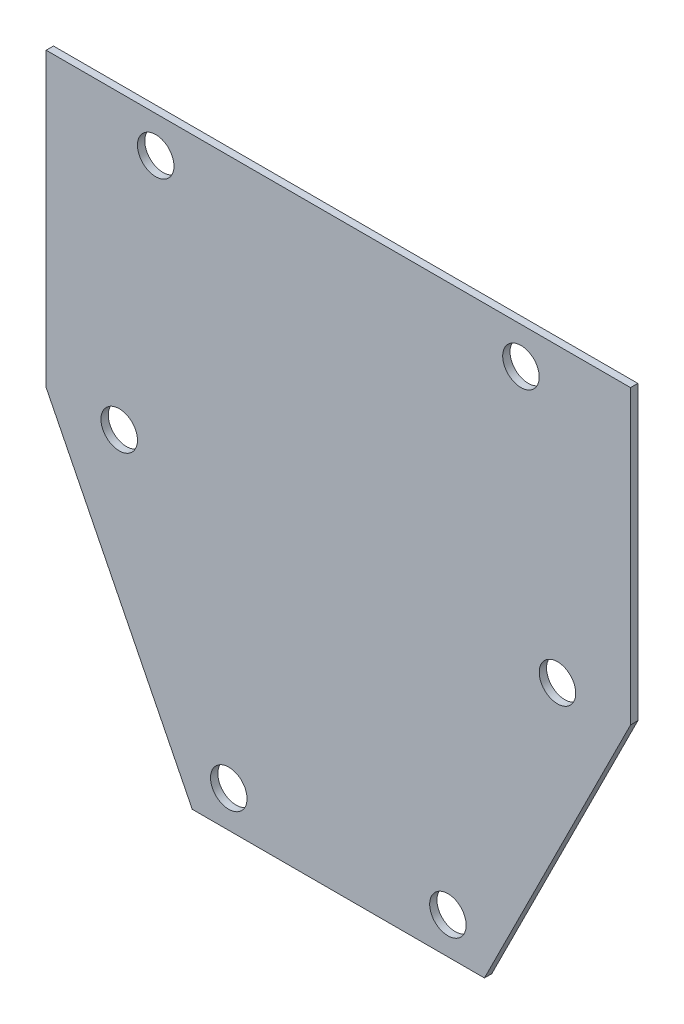
ISO-10303-21;
HEADER;
FILE_DESCRIPTION(('STEP AP214'),'2;1');
FILE_NAME('part.step','',(''),(''),'','','');
FILE_SCHEMA(('AUTOMOTIVE_DESIGN { 1 0 10303 214 1 1 1 1 }'));
ENDSEC;
DATA;
#1=APPLICATION_CONTEXT('core data for automotive mechanical design processes');
#2=APPLICATION_PROTOCOL_DEFINITION('international standard','automotive_design',2000,#1);
#3=PRODUCT_CONTEXT('',#1,'mechanical');
#4=PRODUCT('Part','Part','',(#3));
#5=PRODUCT_RELATED_PRODUCT_CATEGORY('part','',(#4));
#6=PRODUCT_DEFINITION_FORMATION('','',#4);
#7=PRODUCT_DEFINITION_CONTEXT('part definition',#1,'design');
#8=PRODUCT_DEFINITION('design','',#6,#7);
#9=PRODUCT_DEFINITION_SHAPE('','',#8);
#10=(LENGTH_UNIT() NAMED_UNIT(*) SI_UNIT(.MILLI.,.METRE.));
#11=(NAMED_UNIT(*) PLANE_ANGLE_UNIT() SI_UNIT($,.RADIAN.));
#12=(NAMED_UNIT(*) SI_UNIT($,.STERADIAN.) SOLID_ANGLE_UNIT());
#13=UNCERTAINTY_MEASURE_WITH_UNIT(LENGTH_MEASURE(1.E-05),#10,'distance_accuracy_value','');
#14=(GEOMETRIC_REPRESENTATION_CONTEXT(3) GLOBAL_UNCERTAINTY_ASSIGNED_CONTEXT((#13)) GLOBAL_UNIT_ASSIGNED_CONTEXT((#10,
#11,#12)) REPRESENTATION_CONTEXT('',''));
#15=CARTESIAN_POINT('',(0.,0.,0.));
#16=DIRECTION('',(0.,0.,1.));
#17=DIRECTION('',(1.,0.,0.));
#18=AXIS2_PLACEMENT_3D('',#15,#16,#17);
#19=CARTESIAN_POINT('',(32.,-16.,0.5));
#20=DIRECTION('',(0.894427190999916,-0.447213595499958,0.));
#21=DIRECTION('',(0.447213595499958,0.894427190999916,0.));
#22=AXIS2_PLACEMENT_3D('',#19,#20,#21);
#23=PLANE('',#22);
#24=DIRECTION('',(-0.447213595499958,-0.894427190999916,0.));
#25=VECTOR('',#24,1.);
#26=CARTESIAN_POINT('',(32.,-16.,-0.5));
#27=LINE('',#26,#25);
#28=CARTESIAN_POINT('',(40.,0.,-0.5));
#29=VERTEX_POINT('',#28);
#30=CARTESIAN_POINT('',(20.,-40.,-0.5));
#31=VERTEX_POINT('',#30);
#32=EDGE_CURVE('E146',#29,#31,#27,.T.);
#33=ORIENTED_EDGE('',*,*,#32,.F.);
#34=DIRECTION('',(0.,0.,-1.));
#35=VECTOR('',#34,1.);
#36=CARTESIAN_POINT('',(40.,0.,0.5));
#37=LINE('',#36,#35);
#38=CARTESIAN_POINT('',(40.,0.,0.5));
#39=VERTEX_POINT('',#38);
#40=EDGE_CURVE('E11',#39,#29,#37,.T.);
#41=ORIENTED_EDGE('',*,*,#40,.F.);
#42=DIRECTION('',(-0.447213595499958,-0.894427190999916,0.));
#43=VECTOR('',#42,1.);
#44=CARTESIAN_POINT('',(32.,-16.,0.5));
#45=LINE('',#44,#43);
#46=CARTESIAN_POINT('',(20.,-40.,0.5));
#47=VERTEX_POINT('',#46);
#48=EDGE_CURVE('E189',#39,#47,#45,.T.);
#49=ORIENTED_EDGE('',*,*,#48,.T.);
#50=DIRECTION('',(0.,0.,-1.));
#51=VECTOR('',#50,1.);
#52=CARTESIAN_POINT('',(20.,-40.,0.5));
#53=LINE('',#52,#51);
#54=EDGE_CURVE('E90',#47,#31,#53,.T.);
#55=ORIENTED_EDGE('',*,*,#54,.T.);
#56=EDGE_LOOP('',(#33,#41,#49,#55));
#57=FACE_BOUND('',#56,.T.);
#58=ADVANCED_FACE('F45',(#57),#23,.T.);
#59=CARTESIAN_POINT('',(40.,0.,0.5));
#60=DIRECTION('',(1.,0.,0.));
#61=DIRECTION('',(0.,0.,-1.));
#62=AXIS2_PLACEMENT_3D('',#59,#60,#61);
#63=PLANE('',#62);
#64=DIRECTION('',(0.,-1.,0.));
#65=VECTOR('',#64,1.);
#66=CARTESIAN_POINT('',(40.,0.,-0.5));
#67=LINE('',#66,#65);
#68=CARTESIAN_POINT('',(40.,40.,-0.5));
#69=VERTEX_POINT('',#68);
#70=EDGE_CURVE('E149',#69,#29,#67,.T.);
#71=ORIENTED_EDGE('',*,*,#70,.F.);
#72=DIRECTION('',(0.,0.,-1.));
#73=VECTOR('',#72,1.);
#74=CARTESIAN_POINT('',(40.,40.,0.5));
#75=LINE('',#74,#73);
#76=CARTESIAN_POINT('',(40.,40.,0.5));
#77=VERTEX_POINT('',#76);
#78=EDGE_CURVE('E54',#77,#69,#75,.T.);
#79=ORIENTED_EDGE('',*,*,#78,.F.);
#80=DIRECTION('',(0.,-1.,0.));
#81=VECTOR('',#80,1.);
#82=CARTESIAN_POINT('',(40.,0.,0.5));
#83=LINE('',#82,#81);
#84=EDGE_CURVE('E190',#77,#39,#83,.T.);
#85=ORIENTED_EDGE('',*,*,#84,.T.);
#86=ORIENTED_EDGE('',*,*,#40,.T.);
#87=EDGE_LOOP('',(#71,#79,#85,#86));
#88=FACE_BOUND('',#87,.T.);
#89=ADVANCED_FACE('F184',(#88),#63,.T.);
#90=CARTESIAN_POINT('',(0.,40.,0.5));
#91=DIRECTION('',(0.,1.,0.));
#92=DIRECTION('',(0.,0.,1.));
#93=AXIS2_PLACEMENT_3D('',#90,#91,#92);
#94=PLANE('',#93);
#95=DIRECTION('',(1.,0.,0.));
#96=VECTOR('',#95,1.);
#97=CARTESIAN_POINT('',(0.,40.,-0.5));
#98=LINE('',#97,#96);
#99=CARTESIAN_POINT('',(-40.,40.,-0.5));
#100=VERTEX_POINT('',#99);
#101=EDGE_CURVE('E152',#100,#69,#98,.T.);
#102=ORIENTED_EDGE('',*,*,#101,.F.);
#103=DIRECTION('',(0.,0.,-1.));
#104=VECTOR('',#103,1.);
#105=CARTESIAN_POINT('',(-40.,40.,0.5));
#106=LINE('',#105,#104);
#107=CARTESIAN_POINT('',(-40.,40.,0.5));
#108=VERTEX_POINT('',#107);
#109=EDGE_CURVE('E113',#108,#100,#106,.T.);
#110=ORIENTED_EDGE('',*,*,#109,.F.);
#111=DIRECTION('',(1.,0.,0.));
#112=VECTOR('',#111,1.);
#113=CARTESIAN_POINT('',(0.,40.,0.5));
#114=LINE('',#113,#112);
#115=EDGE_CURVE('E121',#108,#77,#114,.T.);
#116=ORIENTED_EDGE('',*,*,#115,.T.);
#117=ORIENTED_EDGE('',*,*,#78,.T.);
#118=EDGE_LOOP('',(#102,#110,#116,#117));
#119=FACE_BOUND('',#118,.T.);
#120=ADVANCED_FACE('F181',(#119),#94,.T.);
#121=CARTESIAN_POINT('',(-40.,0.,0.5));
#122=DIRECTION('',(-1.,0.,0.));
#123=DIRECTION('',(0.,0.,1.));
#124=AXIS2_PLACEMENT_3D('',#121,#122,#123);
#125=PLANE('',#124);
#126=DIRECTION('',(0.,1.,0.));
#127=VECTOR('',#126,1.);
#128=CARTESIAN_POINT('',(-40.,0.,-0.5));
#129=LINE('',#128,#127);
#130=CARTESIAN_POINT('',(-40.,0.,-0.5));
#131=VERTEX_POINT('',#130);
#132=EDGE_CURVE('E108',#131,#100,#129,.T.);
#133=ORIENTED_EDGE('',*,*,#132,.F.);
#134=DIRECTION('',(0.,0.,-1.));
#135=VECTOR('',#134,1.);
#136=CARTESIAN_POINT('',(-40.,0.,0.5));
#137=LINE('',#136,#135);
#138=CARTESIAN_POINT('',(-40.,0.,0.5));
#139=VERTEX_POINT('',#138);
#140=EDGE_CURVE('E103',#139,#131,#137,.T.);
#141=ORIENTED_EDGE('',*,*,#140,.F.);
#142=DIRECTION('',(0.,1.,0.));
#143=VECTOR('',#142,1.);
#144=CARTESIAN_POINT('',(-40.,0.,0.5));
#145=LINE('',#144,#143);
#146=EDGE_CURVE('E106',#139,#108,#145,.T.);
#147=ORIENTED_EDGE('',*,*,#146,.T.);
#148=ORIENTED_EDGE('',*,*,#109,.T.);
#149=EDGE_LOOP('',(#133,#141,#147,#148));
#150=FACE_BOUND('',#149,.T.);
#151=ADVANCED_FACE('F105',(#150),#125,.T.);
#152=CARTESIAN_POINT('',(-32.,-16.,0.5));
#153=DIRECTION('',(-0.894427190999916,-0.447213595499958,0.));
#154=DIRECTION('',(0.447213595499958,-0.894427190999916,0.));
#155=AXIS2_PLACEMENT_3D('',#152,#153,#154);
#156=PLANE('',#155);
#157=DIRECTION('',(-0.447213595499958,0.894427190999916,0.));
#158=VECTOR('',#157,1.);
#159=CARTESIAN_POINT('',(-32.,-16.,-0.5));
#160=LINE('',#159,#158);
#161=CARTESIAN_POINT('',(-20.,-40.,-0.5));
#162=VERTEX_POINT('',#161);
#163=EDGE_CURVE('E156',#162,#131,#160,.T.);
#164=ORIENTED_EDGE('',*,*,#163,.F.);
#165=DIRECTION('',(0.,0.,-1.));
#166=VECTOR('',#165,1.);
#167=CARTESIAN_POINT('',(-20.,-40.,0.5));
#168=LINE('',#167,#166);
#169=CARTESIAN_POINT('',(-20.,-40.,0.5));
#170=VERTEX_POINT('',#169);
#171=EDGE_CURVE('E83',#170,#162,#168,.T.);
#172=ORIENTED_EDGE('',*,*,#171,.F.);
#173=DIRECTION('',(-0.447213595499958,0.894427190999916,0.));
#174=VECTOR('',#173,1.);
#175=CARTESIAN_POINT('',(-32.,-16.,0.5));
#176=LINE('',#175,#174);
#177=EDGE_CURVE('E118',#170,#139,#176,.T.);
#178=ORIENTED_EDGE('',*,*,#177,.T.);
#179=ORIENTED_EDGE('',*,*,#140,.T.);
#180=EDGE_LOOP('',(#164,#172,#178,#179));
#181=FACE_BOUND('',#180,.T.);
#182=ADVANCED_FACE('F123',(#181),#156,.T.);
#183=CARTESIAN_POINT('',(-25.,35.,0.5));
#184=DIRECTION('',(0.,0.,-1.));
#185=DIRECTION('',(-1.,0.,0.));
#186=AXIS2_PLACEMENT_3D('',#183,#184,#185);
#187=CYLINDRICAL_SURFACE('',#186,2.5);
#188=CARTESIAN_POINT('',(-25.,35.,0.5));
#189=DIRECTION('',(0.,0.,1.));
#190=DIRECTION('',(1.,0.,0.));
#191=AXIS2_PLACEMENT_3D('',#188,#189,#190);
#192=CIRCLE('',#191,2.5);
#193=CARTESIAN_POINT('',(-22.5,35.,0.5));
#194=VERTEX_POINT('',#193);
#195=EDGE_CURVE('E137',#194,#194,#192,.T.);
#196=ORIENTED_EDGE('',*,*,#195,.T.);
#197=EDGE_LOOP('',(#196));
#198=FACE_BOUND('',#197,.T.);
#199=CARTESIAN_POINT('',(-25.,35.,-0.5));
#200=DIRECTION('',(0.,0.,1.));
#201=DIRECTION('',(1.,0.,0.));
#202=AXIS2_PLACEMENT_3D('',#199,#200,#201);
#203=CIRCLE('',#202,2.5);
#204=CARTESIAN_POINT('',(-22.5,35.,-0.5));
#205=VERTEX_POINT('',#204);
#206=EDGE_CURVE('E169',#205,#205,#203,.T.);
#207=ORIENTED_EDGE('',*,*,#206,.F.);
#208=EDGE_LOOP('',(#207));
#209=FACE_BOUND('',#208,.T.);
#210=ADVANCED_FACE('F222',(#198,#209),#187,.F.);
#211=CARTESIAN_POINT('',(-15.,-35.,0.5));
#212=DIRECTION('',(0.,0.,-1.));
#213=DIRECTION('',(-1.,0.,0.));
#214=AXIS2_PLACEMENT_3D('',#211,#212,#213);
#215=CYLINDRICAL_SURFACE('',#214,2.5);
#216=CARTESIAN_POINT('',(-15.,-35.,0.5));
#217=DIRECTION('',(0.,0.,1.));
#218=DIRECTION('',(1.,0.,0.));
#219=AXIS2_PLACEMENT_3D('',#216,#217,#218);
#220=CIRCLE('',#219,2.5);
#221=CARTESIAN_POINT('',(-12.5,-35.,0.5));
#222=VERTEX_POINT('',#221);
#223=EDGE_CURVE('E134',#222,#222,#220,.T.);
#224=ORIENTED_EDGE('',*,*,#223,.T.);
#225=EDGE_LOOP('',(#224));
#226=FACE_BOUND('',#225,.T.);
#227=CARTESIAN_POINT('',(-15.,-35.,-0.5));
#228=DIRECTION('',(0.,0.,1.));
#229=DIRECTION('',(1.,0.,0.));
#230=AXIS2_PLACEMENT_3D('',#227,#228,#229);
#231=CIRCLE('',#230,2.5);
#232=CARTESIAN_POINT('',(-12.5,-35.,-0.5));
#233=VERTEX_POINT('',#232);
#234=EDGE_CURVE('E166',#233,#233,#231,.T.);
#235=ORIENTED_EDGE('',*,*,#234,.F.);
#236=EDGE_LOOP('',(#235));
#237=FACE_BOUND('',#236,.T.);
#238=ADVANCED_FACE('F232',(#226,#237),#215,.F.);
#239=CARTESIAN_POINT('',(25.,35.,0.5));
#240=DIRECTION('',(0.,0.,-1.));
#241=DIRECTION('',(-1.,0.,0.));
#242=AXIS2_PLACEMENT_3D('',#239,#240,#241);
#243=CYLINDRICAL_SURFACE('',#242,2.5);
#244=CARTESIAN_POINT('',(25.,35.,0.5));
#245=DIRECTION('',(0.,0.,1.));
#246=DIRECTION('',(1.,0.,0.));
#247=AXIS2_PLACEMENT_3D('',#244,#245,#246);
#248=CIRCLE('',#247,2.5);
#249=CARTESIAN_POINT('',(27.5,35.,0.5));
#250=VERTEX_POINT('',#249);
#251=EDGE_CURVE('E131',#250,#250,#248,.F.);
#252=ORIENTED_EDGE('',*,*,#251,.F.);
#253=EDGE_LOOP('',(#252));
#254=FACE_BOUND('',#253,.T.);
#255=CARTESIAN_POINT('',(25.,35.,-0.5));
#256=DIRECTION('',(0.,0.,1.));
#257=DIRECTION('',(1.,0.,0.));
#258=AXIS2_PLACEMENT_3D('',#255,#256,#257);
#259=CIRCLE('',#258,2.5);
#260=CARTESIAN_POINT('',(27.5,35.,-0.5));
#261=VERTEX_POINT('',#260);
#262=EDGE_CURVE('E163',#261,#261,#259,.F.);
#263=ORIENTED_EDGE('',*,*,#262,.T.);
#264=EDGE_LOOP('',(#263));
#265=FACE_BOUND('',#264,.T.);
#266=ADVANCED_FACE('F228',(#254,#265),#243,.F.);
#267=CARTESIAN_POINT('',(15.,-35.,0.5));
#268=DIRECTION('',(0.,0.,-1.));
#269=DIRECTION('',(-1.,0.,0.));
#270=AXIS2_PLACEMENT_3D('',#267,#268,#269);
#271=CYLINDRICAL_SURFACE('',#270,2.5);
#272=CARTESIAN_POINT('',(15.,-35.,0.5));
#273=DIRECTION('',(0.,0.,1.));
#274=DIRECTION('',(1.,0.,0.));
#275=AXIS2_PLACEMENT_3D('',#272,#273,#274);
#276=CIRCLE('',#275,2.5);
#277=CARTESIAN_POINT('',(17.5,-35.,0.5));
#278=VERTEX_POINT('',#277);
#279=EDGE_CURVE('E125',#278,#278,#276,.F.);
#280=ORIENTED_EDGE('',*,*,#279,.F.);
#281=EDGE_LOOP('',(#280));
#282=FACE_BOUND('',#281,.T.);
#283=CARTESIAN_POINT('',(15.,-35.,-0.5));
#284=DIRECTION('',(0.,0.,1.));
#285=DIRECTION('',(1.,0.,0.));
#286=AXIS2_PLACEMENT_3D('',#283,#284,#285);
#287=CIRCLE('',#286,2.5);
#288=CARTESIAN_POINT('',(17.5,-35.,-0.5));
#289=VERTEX_POINT('',#288);
#290=EDGE_CURVE('E160',#289,#289,#287,.F.);
#291=ORIENTED_EDGE('',*,*,#290,.T.);
#292=EDGE_LOOP('',(#291));
#293=FACE_BOUND('',#292,.T.);
#294=ADVANCED_FACE('F225',(#282,#293),#271,.F.);
#295=CARTESIAN_POINT('',(0.,-40.,0.5));
#296=DIRECTION('',(0.,1.,0.));
#297=DIRECTION('',(-1.,0.,0.));
#298=AXIS2_PLACEMENT_3D('',#295,#296,#297);
#299=PLANE('',#298);
#300=DIRECTION('',(1.,0.,0.));
#301=VECTOR('',#300,1.);
#302=CARTESIAN_POINT('',(0.,-40.,-0.5));
#303=LINE('',#302,#301);
#304=EDGE_CURVE('E158',#162,#31,#303,.T.);
#305=ORIENTED_EDGE('',*,*,#304,.T.);
#306=ORIENTED_EDGE('',*,*,#54,.F.);
#307=DIRECTION('',(1.,0.,0.));
#308=VECTOR('',#307,1.);
#309=CARTESIAN_POINT('',(0.,-40.,0.5));
#310=LINE('',#309,#308);
#311=EDGE_CURVE('E62',#170,#47,#310,.T.);
#312=ORIENTED_EDGE('',*,*,#311,.F.);
#313=ORIENTED_EDGE('',*,*,#171,.T.);
#314=EDGE_LOOP('',(#305,#306,#312,#313));
#315=FACE_BOUND('',#314,.T.);
#316=ADVANCED_FACE('F188',(#315),#299,.F.);
#317=CARTESIAN_POINT('',(30.,0.,0.5));
#318=DIRECTION('',(0.,0.,-1.));
#319=DIRECTION('',(-1.,0.,0.));
#320=AXIS2_PLACEMENT_3D('',#317,#318,#319);
#321=CYLINDRICAL_SURFACE('',#320,2.5);
#322=CARTESIAN_POINT('',(30.,0.,0.5));
#323=DIRECTION('',(0.,0.,1.));
#324=DIRECTION('',(1.,0.,0.));
#325=AXIS2_PLACEMENT_3D('',#322,#323,#324);
#326=CIRCLE('',#325,2.5);
#327=CARTESIAN_POINT('',(32.5,0.,0.5));
#328=VERTEX_POINT('',#327);
#329=EDGE_CURVE('E175',#328,#328,#326,.F.);
#330=ORIENTED_EDGE('',*,*,#329,.F.);
#331=EDGE_LOOP('',(#330));
#332=FACE_BOUND('',#331,.T.);
#333=CARTESIAN_POINT('',(30.,0.,-0.5));
#334=DIRECTION('',(0.,0.,1.));
#335=DIRECTION('',(1.,0.,0.));
#336=AXIS2_PLACEMENT_3D('',#333,#334,#335);
#337=CIRCLE('',#336,2.5);
#338=CARTESIAN_POINT('',(32.5,0.,-0.5));
#339=VERTEX_POINT('',#338);
#340=EDGE_CURVE('E143',#339,#339,#337,.F.);
#341=ORIENTED_EDGE('',*,*,#340,.T.);
#342=EDGE_LOOP('',(#341));
#343=FACE_BOUND('',#342,.T.);
#344=ADVANCED_FACE('F47',(#332,#343),#321,.F.);
#345=CARTESIAN_POINT('',(-30.,0.,0.5));
#346=DIRECTION('',(0.,0.,-1.));
#347=DIRECTION('',(-1.,0.,0.));
#348=AXIS2_PLACEMENT_3D('',#345,#346,#347);
#349=CYLINDRICAL_SURFACE('',#348,2.5);
#350=CARTESIAN_POINT('',(-30.,0.,0.5));
#351=DIRECTION('',(0.,0.,1.));
#352=DIRECTION('',(1.,0.,0.));
#353=AXIS2_PLACEMENT_3D('',#350,#351,#352);
#354=CIRCLE('',#353,2.5);
#355=CARTESIAN_POINT('',(-27.5,0.,0.5));
#356=VERTEX_POINT('',#355);
#357=EDGE_CURVE('E140',#356,#356,#354,.T.);
#358=ORIENTED_EDGE('',*,*,#357,.T.);
#359=EDGE_LOOP('',(#358));
#360=FACE_BOUND('',#359,.T.);
#361=CARTESIAN_POINT('',(-30.,0.,-0.5));
#362=DIRECTION('',(0.,0.,1.));
#363=DIRECTION('',(1.,0.,0.));
#364=AXIS2_PLACEMENT_3D('',#361,#362,#363);
#365=CIRCLE('',#364,2.5);
#366=CARTESIAN_POINT('',(-27.5,0.,-0.5));
#367=VERTEX_POINT('',#366);
#368=EDGE_CURVE('E172',#367,#367,#365,.T.);
#369=ORIENTED_EDGE('',*,*,#368,.F.);
#370=EDGE_LOOP('',(#369));
#371=FACE_BOUND('',#370,.T.);
#372=ADVANCED_FACE('F200',(#360,#371),#349,.F.);
#373=CARTESIAN_POINT('',(0.,0.,0.5));
#374=DIRECTION('',(0.,0.,1.));
#375=DIRECTION('',(1.,0.,0.));
#376=AXIS2_PLACEMENT_3D('',#373,#374,#375);
#377=PLANE('',#376);
#378=ORIENTED_EDGE('',*,*,#329,.T.);
#379=EDGE_LOOP('',(#378));
#380=FACE_BOUND('',#379,.T.);
#381=ORIENTED_EDGE('',*,*,#48,.F.);
#382=ORIENTED_EDGE('',*,*,#84,.F.);
#383=ORIENTED_EDGE('',*,*,#115,.F.);
#384=ORIENTED_EDGE('',*,*,#146,.F.);
#385=ORIENTED_EDGE('',*,*,#177,.F.);
#386=ORIENTED_EDGE('',*,*,#311,.T.);
#387=EDGE_LOOP('',(#381,#382,#383,#384,#385,#386));
#388=FACE_BOUND('',#387,.T.);
#389=ORIENTED_EDGE('',*,*,#279,.T.);
#390=EDGE_LOOP('',(#389));
#391=FACE_BOUND('',#390,.T.);
#392=ORIENTED_EDGE('',*,*,#251,.T.);
#393=EDGE_LOOP('',(#392));
#394=FACE_BOUND('',#393,.T.);
#395=ORIENTED_EDGE('',*,*,#223,.F.);
#396=EDGE_LOOP('',(#395));
#397=FACE_BOUND('',#396,.T.);
#398=ORIENTED_EDGE('',*,*,#195,.F.);
#399=EDGE_LOOP('',(#398));
#400=FACE_BOUND('',#399,.T.);
#401=ORIENTED_EDGE('',*,*,#357,.F.);
#402=EDGE_LOOP('',(#401));
#403=FACE_BOUND('',#402,.T.);
#404=ADVANCED_FACE('F116',(#380,#388,#391,#394,#397,#400,#403),#377,.T.);
#405=CARTESIAN_POINT('',(0.,0.,-0.5));
#406=DIRECTION('',(0.,0.,1.));
#407=DIRECTION('',(1.,0.,0.));
#408=AXIS2_PLACEMENT_3D('',#405,#406,#407);
#409=PLANE('',#408);
#410=ORIENTED_EDGE('',*,*,#340,.F.);
#411=EDGE_LOOP('',(#410));
#412=FACE_BOUND('',#411,.T.);
#413=ORIENTED_EDGE('',*,*,#32,.T.);
#414=ORIENTED_EDGE('',*,*,#304,.F.);
#415=ORIENTED_EDGE('',*,*,#163,.T.);
#416=ORIENTED_EDGE('',*,*,#132,.T.);
#417=ORIENTED_EDGE('',*,*,#101,.T.);
#418=ORIENTED_EDGE('',*,*,#70,.T.);
#419=EDGE_LOOP('',(#413,#414,#415,#416,#417,#418));
#420=FACE_BOUND('',#419,.T.);
#421=ORIENTED_EDGE('',*,*,#290,.F.);
#422=EDGE_LOOP('',(#421));
#423=FACE_BOUND('',#422,.T.);
#424=ORIENTED_EDGE('',*,*,#262,.F.);
#425=EDGE_LOOP('',(#424));
#426=FACE_BOUND('',#425,.T.);
#427=ORIENTED_EDGE('',*,*,#234,.T.);
#428=EDGE_LOOP('',(#427));
#429=FACE_BOUND('',#428,.T.);
#430=ORIENTED_EDGE('',*,*,#206,.T.);
#431=EDGE_LOOP('',(#430));
#432=FACE_BOUND('',#431,.T.);
#433=ORIENTED_EDGE('',*,*,#368,.T.);
#434=EDGE_LOOP('',(#433));
#435=FACE_BOUND('',#434,.T.);
#436=ADVANCED_FACE('F186',(#412,#420,#423,#426,#429,#432,#435),#409,.F.);
#437=CLOSED_SHELL('',(#58,#89,#120,#151,#182,#210,#238,#266,#294,#316,#344,#372,#404,#436));
#438=MANIFOLD_SOLID_BREP('B2',#437);
#439=ADVANCED_BREP_SHAPE_REPRESENTATION('',(#18,#438),#14);
#440=SHAPE_DEFINITION_REPRESENTATION(#9,#439);
ENDSEC;
END-ISO-10303-21;
